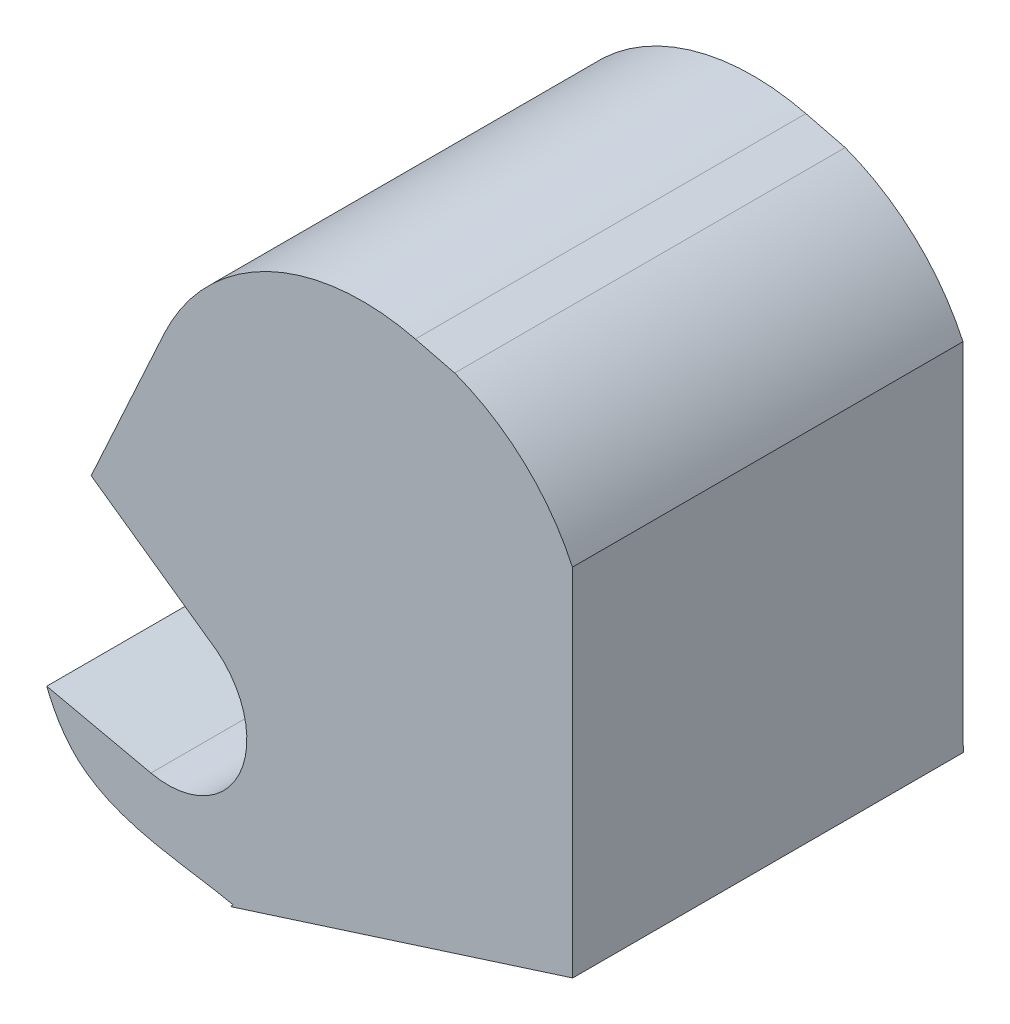
ISO-10303-21;
HEADER;
FILE_DESCRIPTION(('STEP AP214'),'2;1');
FILE_NAME('part.step','',(''),(''),'','','');
FILE_SCHEMA(('AUTOMOTIVE_DESIGN { 1 0 10303 214 1 1 1 1 }'));
ENDSEC;
DATA;
#1=APPLICATION_CONTEXT('core data for automotive mechanical design processes');
#2=APPLICATION_PROTOCOL_DEFINITION('international standard','automotive_design',2000,#1);
#3=PRODUCT_CONTEXT('',#1,'mechanical');
#4=PRODUCT('Part','Part','',(#3));
#5=PRODUCT_RELATED_PRODUCT_CATEGORY('part','',(#4));
#6=PRODUCT_DEFINITION_FORMATION('','',#4);
#7=PRODUCT_DEFINITION_CONTEXT('part definition',#1,'design');
#8=PRODUCT_DEFINITION('design','',#6,#7);
#9=PRODUCT_DEFINITION_SHAPE('','',#8);
#10=(LENGTH_UNIT() NAMED_UNIT(*) SI_UNIT(.MILLI.,.METRE.));
#11=(NAMED_UNIT(*) PLANE_ANGLE_UNIT() SI_UNIT($,.RADIAN.));
#12=(NAMED_UNIT(*) SI_UNIT($,.STERADIAN.) SOLID_ANGLE_UNIT());
#13=UNCERTAINTY_MEASURE_WITH_UNIT(LENGTH_MEASURE(1.E-05),#10,'distance_accuracy_value','');
#14=(GEOMETRIC_REPRESENTATION_CONTEXT(3) GLOBAL_UNCERTAINTY_ASSIGNED_CONTEXT((#13)) GLOBAL_UNIT_ASSIGNED_CONTEXT((#10,
#11,#12)) REPRESENTATION_CONTEXT('',''));
#15=CARTESIAN_POINT('',(0.,0.,0.));
#16=DIRECTION('',(0.,0.,1.));
#17=DIRECTION('',(1.,0.,0.));
#18=AXIS2_PLACEMENT_3D('',#15,#16,#17);
#19=CARTESIAN_POINT('',(153.531390596857,-39.6951812941398,13.));
#20=DIRECTION('',(0.576730976553272,0.816934134850484,0.));
#21=DIRECTION('',(-0.816934134850484,0.576730976553272,0.));
#22=AXIS2_PLACEMENT_3D('',#19,#20,#21);
#23=PLANE('',#22);
#24=DIRECTION('',(0.816934134850484,-0.576730976553272,0.));
#25=VECTOR('',#24,1.);
#26=CARTESIAN_POINT('',(153.531390596857,-39.6951812941398,0.));
#27=LINE('',#26,#25);
#28=CARTESIAN_POINT('',(153.531390596857,-39.6951812941398,0.));
#29=VERTEX_POINT('',#28);
#30=CARTESIAN_POINT('',(157.716593531203,-42.6498089347643,0.));
#31=VERTEX_POINT('',#30);
#32=EDGE_CURVE('E148',#29,#31,#27,.T.);
#33=ORIENTED_EDGE('',*,*,#32,.T.);
#34=DIRECTION('',(0.,0.,-1.));
#35=VECTOR('',#34,1.);
#36=CARTESIAN_POINT('',(157.716593531203,-42.6498089347643,13.));
#37=LINE('',#36,#35);
#38=CARTESIAN_POINT('',(157.716593531203,-42.6498089347643,13.));
#39=VERTEX_POINT('',#38);
#40=EDGE_CURVE('E11',#39,#31,#37,.T.);
#41=ORIENTED_EDGE('',*,*,#40,.F.);
#42=DIRECTION('',(0.816934134850484,-0.576730976553272,0.));
#43=VECTOR('',#42,1.);
#44=CARTESIAN_POINT('',(153.531390596857,-39.6951812941398,13.));
#45=LINE('',#44,#43);
#46=CARTESIAN_POINT('',(153.531390596857,-39.6951812941398,13.));
#47=VERTEX_POINT('',#46);
#48=EDGE_CURVE('E179',#47,#39,#45,.T.);
#49=ORIENTED_EDGE('',*,*,#48,.F.);
#50=DIRECTION('',(0.,0.,-1.));
#51=VECTOR('',#50,1.);
#52=CARTESIAN_POINT('',(153.531390596857,-39.6951812941398,13.));
#53=LINE('',#52,#51);
#54=EDGE_CURVE('E49',#47,#29,#53,.T.);
#55=ORIENTED_EDGE('',*,*,#54,.T.);
#56=EDGE_LOOP('',(#33,#41,#49,#55));
#57=FACE_BOUND('',#56,.T.);
#58=ADVANCED_FACE('F33',(#57),#23,.F.);
#59=CARTESIAN_POINT('',(156.089309253376,-44.7095591329998,13.));
#60=DIRECTION('',(0.,0.,-1.));
#61=DIRECTION('',(-1.,0.,0.));
#62=AXIS2_PLACEMENT_3D('',#59,#60,#61);
#63=CYLINDRICAL_SURFACE('',#62,2.62499999999874);
#64=CARTESIAN_POINT('',(156.089309253376,-44.7095591329998,0.));
#65=DIRECTION('',(0.,0.,-1.));
#66=DIRECTION('',(-1.,0.,0.));
#67=AXIS2_PLACEMENT_3D('',#64,#65,#66);
#68=CIRCLE('',#67,2.62499999999874);
#69=CARTESIAN_POINT('',(155.520515025164,-47.2721941296286,0.));
#70=VERTEX_POINT('',#69);
#71=EDGE_CURVE('E150',#31,#70,#68,.T.);
#72=ORIENTED_EDGE('',*,*,#71,.T.);
#73=DIRECTION('',(0.,0.,-1.));
#74=VECTOR('',#73,1.);
#75=CARTESIAN_POINT('',(155.520515025164,-47.2721941296286,13.));
#76=LINE('',#75,#74);
#77=CARTESIAN_POINT('',(155.520515025164,-47.2721941296286,13.));
#78=VERTEX_POINT('',#77);
#79=EDGE_CURVE('E41',#78,#70,#76,.T.);
#80=ORIENTED_EDGE('',*,*,#79,.F.);
#81=CARTESIAN_POINT('',(156.089309253376,-44.7095591329998,13.));
#82=DIRECTION('',(0.,0.,-1.));
#83=DIRECTION('',(-1.,0.,0.));
#84=AXIS2_PLACEMENT_3D('',#81,#82,#83);
#85=CIRCLE('',#84,2.62499999999874);
#86=EDGE_CURVE('E97',#39,#78,#85,.T.);
#87=ORIENTED_EDGE('',*,*,#86,.F.);
#88=ORIENTED_EDGE('',*,*,#40,.T.);
#89=EDGE_LOOP('',(#72,#80,#87,#88));
#90=FACE_BOUND('',#89,.T.);
#91=ADVANCED_FACE('F230',(#90),#63,.F.);
#92=CARTESIAN_POINT('',(155.520515025164,-47.2721941296286,13.));
#93=DIRECTION('',(-0.216683515509158,-0.976241903478125,0.));
#94=DIRECTION('',(0.976241903478125,-0.216683515509158,0.));
#95=AXIS2_PLACEMENT_3D('',#92,#93,#94);
#96=PLANE('',#95);
#97=DIRECTION('',(-0.976241903478125,0.216683515509158,0.));
#98=VECTOR('',#97,1.);
#99=CARTESIAN_POINT('',(155.520515025164,-47.2721941296286,0.));
#100=LINE('',#99,#98);
#101=CARTESIAN_POINT('',(152.052832095,-46.5025183706777,0.));
#102=VERTEX_POINT('',#101);
#103=EDGE_CURVE('E152',#70,#102,#100,.T.);
#104=ORIENTED_EDGE('',*,*,#103,.T.);
#105=DIRECTION('',(0.,0.,-1.));
#106=VECTOR('',#105,1.);
#107=CARTESIAN_POINT('',(152.052832095,-46.5025183706777,13.));
#108=LINE('',#107,#106);
#109=CARTESIAN_POINT('',(152.052832095,-46.5025183706777,13.));
#110=VERTEX_POINT('',#109);
#111=EDGE_CURVE('E192',#110,#102,#108,.T.);
#112=ORIENTED_EDGE('',*,*,#111,.F.);
#113=DIRECTION('',(-0.976241903478125,0.216683515509158,0.));
#114=VECTOR('',#113,1.);
#115=CARTESIAN_POINT('',(155.520515025164,-47.2721941296286,13.));
#116=LINE('',#115,#114);
#117=EDGE_CURVE('E199',#78,#110,#116,.T.);
#118=ORIENTED_EDGE('',*,*,#117,.F.);
#119=ORIENTED_EDGE('',*,*,#79,.T.);
#120=EDGE_LOOP('',(#104,#112,#118,#119));
#121=FACE_BOUND('',#120,.T.);
#122=ADVANCED_FACE('F197',(#121),#96,.F.);
#123=CARTESIAN_POINT('',(158.254307893064,-49.7029906048317,13.));
#124=CARTESIAN_POINT('',(156.613856564801,-49.3342334953604,13.));
#125=CARTESIAN_POINT('',(153.519768391345,-49.2918997548251,13.));
#126=CARTESIAN_POINT('',(152.261746259738,-47.0330827984404,13.));
#127=CARTESIAN_POINT('',(152.052832095,-46.5025183706777,13.));
#128=B_SPLINE_CURVE_WITH_KNOTS('',3,(#123,#124,#125,#126,#127),.UNSPECIFIED.,.F.,.F.,(4,1,4),
(0.,0.763192252642205,1.),.UNSPECIFIED.);
#129=DIRECTION('',(0.,0.,-1.));
#130=VECTOR('',#129,1.);
#131=SURFACE_OF_LINEAR_EXTRUSION('',#128,#130);
#132=CARTESIAN_POINT('',(158.254307893064,-49.7029906048317,0.));
#133=CARTESIAN_POINT('',(156.613856564801,-49.3342334953604,0.));
#134=CARTESIAN_POINT('',(153.519768391345,-49.2918997548251,0.));
#135=CARTESIAN_POINT('',(152.261746259738,-47.0330827984404,0.));
#136=CARTESIAN_POINT('',(152.052832095,-46.5025183706777,0.));
#137=B_SPLINE_CURVE_WITH_KNOTS('',3,(#132,#133,#134,#135,#136),.UNSPECIFIED.,.F.,.F.,(4,1,4),
(0.,0.763192252642205,1.),.UNSPECIFIED.);
#138=CARTESIAN_POINT('',(158.254307893064,-49.7029906048317,0.));
#139=VERTEX_POINT('',#138);
#140=EDGE_CURVE('E155',#139,#102,#137,.T.);
#141=ORIENTED_EDGE('',*,*,#140,.F.);
#142=DIRECTION('',(0.,0.,-1.));
#143=VECTOR('',#142,1.);
#144=CARTESIAN_POINT('',(158.254307893064,-49.7029906048317,13.));
#145=LINE('',#144,#143);
#146=CARTESIAN_POINT('',(158.254307893064,-49.7029906048317,13.));
#147=VERTEX_POINT('',#146);
#148=EDGE_CURVE('E190',#147,#139,#145,.T.);
#149=ORIENTED_EDGE('',*,*,#148,.F.);
#150=EDGE_CURVE('E209',#147,#110,#128,.T.);
#151=ORIENTED_EDGE('',*,*,#150,.T.);
#152=ORIENTED_EDGE('',*,*,#111,.T.);
#153=EDGE_LOOP('',(#141,#149,#151,#152));
#154=FACE_BOUND('',#153,.T.);
#155=ADVANCED_FACE('F205',(#154),#131,.T.);
#156=CARTESIAN_POINT('',(158.254307893064,-49.7029906048317,13.));
#157=DIRECTION('',(0.752580551806248,-0.658500199728902,0.));
#158=DIRECTION('',(0.658500199728902,0.752580551806248,0.));
#159=AXIS2_PLACEMENT_3D('',#156,#157,#158);
#160=PLANE('',#159);
#161=DIRECTION('',(-0.658500199728902,-0.752580551806248,0.));
#162=VECTOR('',#161,1.);
#163=CARTESIAN_POINT('',(158.254307893064,-49.7029906048317,0.));
#164=LINE('',#163,#162);
#165=CARTESIAN_POINT('',(158.172150746612,-49.7968855962634,0.));
#166=VERTEX_POINT('',#165);
#167=EDGE_CURVE('E160',#139,#166,#164,.T.);
#168=ORIENTED_EDGE('',*,*,#167,.T.);
#169=DIRECTION('',(0.,0.,-1.));
#170=VECTOR('',#169,1.);
#171=CARTESIAN_POINT('',(158.172150746612,-49.7968855962634,13.));
#172=LINE('',#171,#170);
#173=CARTESIAN_POINT('',(158.172150746612,-49.7968855962634,13.));
#174=VERTEX_POINT('',#173);
#175=EDGE_CURVE('E188',#174,#166,#172,.T.);
#176=ORIENTED_EDGE('',*,*,#175,.F.);
#177=DIRECTION('',(-0.658500199728902,-0.752580551806248,0.));
#178=VECTOR('',#177,1.);
#179=CARTESIAN_POINT('',(158.254307893064,-49.7029906048317,13.));
#180=LINE('',#179,#178);
#181=EDGE_CURVE('E210',#147,#174,#180,.T.);
#182=ORIENTED_EDGE('',*,*,#181,.F.);
#183=ORIENTED_EDGE('',*,*,#148,.T.);
#184=EDGE_LOOP('',(#168,#176,#182,#183));
#185=FACE_BOUND('',#184,.T.);
#186=ADVANCED_FACE('F227',(#185),#160,.F.);
#187=CARTESIAN_POINT('',(169.562304458751,-46.160309930931,13.));
#188=DIRECTION('',(0.304147973316343,-0.952624800394972,0.));
#189=DIRECTION('',(0.952624800394973,0.304147973316343,0.));
#190=AXIS2_PLACEMENT_3D('',#187,#188,#189);
#191=PLANE('',#190);
#192=DIRECTION('',(-0.952624800394972,-0.304147973316343,0.));
#193=VECTOR('',#192,1.);
#194=CARTESIAN_POINT('',(169.562304458751,-46.160309930931,0.));
#195=LINE('',#194,#193);
#196=CARTESIAN_POINT('',(169.562304458751,-46.160309930931,0.));
#197=VERTEX_POINT('',#196);
#198=EDGE_CURVE('E166',#197,#166,#195,.T.);
#199=ORIENTED_EDGE('',*,*,#198,.F.);
#200=DIRECTION('',(0.,0.,-1.));
#201=VECTOR('',#200,1.);
#202=CARTESIAN_POINT('',(169.562304458751,-46.160309930931,13.));
#203=LINE('',#202,#201);
#204=CARTESIAN_POINT('',(169.562304458751,-46.160309930931,13.));
#205=VERTEX_POINT('',#204);
#206=EDGE_CURVE('E186',#205,#197,#203,.T.);
#207=ORIENTED_EDGE('',*,*,#206,.F.);
#208=DIRECTION('',(-0.952624800394972,-0.304147973316343,0.));
#209=VECTOR('',#208,1.);
#210=CARTESIAN_POINT('',(169.562304458751,-46.160309930931,13.));
#211=LINE('',#210,#209);
#212=EDGE_CURVE('E212',#205,#174,#211,.T.);
#213=ORIENTED_EDGE('',*,*,#212,.T.);
#214=ORIENTED_EDGE('',*,*,#175,.T.);
#215=EDGE_LOOP('',(#199,#207,#213,#214));
#216=FACE_BOUND('',#215,.T.);
#217=ADVANCED_FACE('F255',(#216),#191,.T.);
#218=CARTESIAN_POINT('',(169.562304458751,-46.160309930931,13.));
#219=DIRECTION('',(-0.999999661893914,-0.000822321140600925,0.));
#220=DIRECTION('',(0.000822321140600925,-0.999999661893914,0.));
#221=AXIS2_PLACEMENT_3D('',#218,#219,#220);
#222=PLANE('',#221);
#223=DIRECTION('',(-0.000822321140600925,0.999999661893914,0.));
#224=VECTOR('',#223,1.);
#225=CARTESIAN_POINT('',(169.562304458751,-46.160309930931,0.));
#226=LINE('',#225,#224);
#227=CARTESIAN_POINT('',(169.552568547295,-34.3207649130281,0.));
#228=VERTEX_POINT('',#227);
#229=EDGE_CURVE('E169',#197,#228,#226,.T.);
#230=ORIENTED_EDGE('',*,*,#229,.T.);
#231=DIRECTION('',(0.,0.,-1.));
#232=VECTOR('',#231,1.);
#233=CARTESIAN_POINT('',(169.552568547295,-34.3207649130281,13.));
#234=LINE('',#233,#232);
#235=CARTESIAN_POINT('',(169.552568547295,-34.3207649130281,13.));
#236=VERTEX_POINT('',#235);
#237=EDGE_CURVE('E183',#236,#228,#234,.T.);
#238=ORIENTED_EDGE('',*,*,#237,.F.);
#239=DIRECTION('',(-0.000822321140600925,0.999999661893914,0.));
#240=VECTOR('',#239,1.);
#241=CARTESIAN_POINT('',(169.562304458751,-46.160309930931,13.));
#242=LINE('',#241,#240);
#243=EDGE_CURVE('E270',#205,#236,#242,.T.);
#244=ORIENTED_EDGE('',*,*,#243,.F.);
#245=ORIENTED_EDGE('',*,*,#206,.T.);
#246=EDGE_LOOP('',(#230,#238,#244,#245));
#247=FACE_BOUND('',#246,.T.);
#248=ADVANCED_FACE('F252',(#247),#222,.F.);
#249=CARTESIAN_POINT('',(163.163670513292,-37.2765831700951,13.));
#250=DIRECTION('',(0.,0.,-1.));
#251=DIRECTION('',(-1.,0.,0.));
#252=AXIS2_PLACEMENT_3D('',#249,#250,#251);
#253=CYLINDRICAL_SURFACE('',#252,7.03952268678084);
#254=CARTESIAN_POINT('',(163.163670513292,-37.2765831700951,0.));
#255=DIRECTION('',(0.,0.,1.));
#256=DIRECTION('',(1.,0.,0.));
#257=AXIS2_PLACEMENT_3D('',#254,#255,#256);
#258=CIRCLE('',#257,7.03952268678084);
#259=CARTESIAN_POINT('',(165.631816979212,-30.683925687678,0.));
#260=VERTEX_POINT('',#259);
#261=EDGE_CURVE('E171',#228,#260,#258,.T.);
#262=ORIENTED_EDGE('',*,*,#261,.T.);
#263=DIRECTION('',(0.,0.,-1.));
#264=VECTOR('',#263,1.);
#265=CARTESIAN_POINT('',(165.631816979212,-30.683925687678,13.));
#266=LINE('',#265,#264);
#267=CARTESIAN_POINT('',(165.631816979212,-30.683925687678,13.));
#268=VERTEX_POINT('',#267);
#269=EDGE_CURVE('E140',#268,#260,#266,.T.);
#270=ORIENTED_EDGE('',*,*,#269,.F.);
#271=CARTESIAN_POINT('',(163.163670513292,-37.2765831700951,13.));
#272=DIRECTION('',(0.,0.,1.));
#273=DIRECTION('',(1.,0.,0.));
#274=AXIS2_PLACEMENT_3D('',#271,#272,#273);
#275=CIRCLE('',#274,7.03952268678084);
#276=EDGE_CURVE('E128',#236,#268,#275,.T.);
#277=ORIENTED_EDGE('',*,*,#276,.F.);
#278=ORIENTED_EDGE('',*,*,#237,.T.);
#279=EDGE_LOOP('',(#262,#270,#277,#278));
#280=FACE_BOUND('',#279,.T.);
#281=ADVANCED_FACE('F249',(#280),#253,.T.);
#282=CARTESIAN_POINT('',(165.631816979212,-30.683925687678,13.));
#283=DIRECTION('',(-0.241123919279596,-0.970494335661598,0.));
#284=DIRECTION('',(0.970494335661598,-0.241123919279596,0.));
#285=AXIS2_PLACEMENT_3D('',#282,#283,#284);
#286=PLANE('',#285);
#287=DIRECTION('',(-0.970494335661598,0.241123919279596,0.));
#288=VECTOR('',#287,1.);
#289=CARTESIAN_POINT('',(165.631816979212,-30.683925687678,0.));
#290=LINE('',#289,#288);
#291=CARTESIAN_POINT('',(164.324728960447,-30.3591734718774,0.));
#292=VERTEX_POINT('',#291);
#293=EDGE_CURVE('E137',#260,#292,#290,.T.);
#294=ORIENTED_EDGE('',*,*,#293,.T.);
#295=DIRECTION('',(0.,0.,-1.));
#296=VECTOR('',#295,1.);
#297=CARTESIAN_POINT('',(164.324728960447,-30.3591734718774,13.));
#298=LINE('',#297,#296);
#299=CARTESIAN_POINT('',(164.324728960447,-30.3591734718774,13.));
#300=VERTEX_POINT('',#299);
#301=EDGE_CURVE('E134',#300,#292,#298,.T.);
#302=ORIENTED_EDGE('',*,*,#301,.F.);
#303=DIRECTION('',(-0.970494335661598,0.241123919279596,0.));
#304=VECTOR('',#303,1.);
#305=CARTESIAN_POINT('',(165.631816979212,-30.683925687678,13.));
#306=LINE('',#305,#304);
#307=EDGE_CURVE('E121',#268,#300,#306,.T.);
#308=ORIENTED_EDGE('',*,*,#307,.F.);
#309=ORIENTED_EDGE('',*,*,#269,.T.);
#310=EDGE_LOOP('',(#294,#302,#308,#309));
#311=FACE_BOUND('',#310,.T.);
#312=ADVANCED_FACE('F135',(#311),#286,.F.);
#313=CARTESIAN_POINT('',(162.571406159357,-37.4160836785785,13.));
#314=DIRECTION('',(0.,0.,-1.));
#315=DIRECTION('',(-1.,0.,0.));
#316=AXIS2_PLACEMENT_3D('',#313,#314,#315);
#317=CYLINDRICAL_SURFACE('',#316,7.27145944843701);
#318=CARTESIAN_POINT('',(162.571406159357,-37.4160836785785,0.));
#319=DIRECTION('',(0.,0.,1.));
#320=DIRECTION('',(1.,0.,0.));
#321=AXIS2_PLACEMENT_3D('',#318,#319,#320);
#322=CIRCLE('',#321,7.27145944843701);
#323=CARTESIAN_POINT('',(155.959571945965,-34.3899027776923,0.));
#324=VERTEX_POINT('',#323);
#325=EDGE_CURVE('E174',#292,#324,#322,.T.);
#326=ORIENTED_EDGE('',*,*,#325,.T.);
#327=DIRECTION('',(0.,0.,-1.));
#328=VECTOR('',#327,1.);
#329=CARTESIAN_POINT('',(155.959571945965,-34.3899027776923,13.));
#330=LINE('',#329,#328);
#331=CARTESIAN_POINT('',(155.959571945965,-34.3899027776923,13.));
#332=VERTEX_POINT('',#331);
#333=EDGE_CURVE('E85',#332,#324,#330,.T.);
#334=ORIENTED_EDGE('',*,*,#333,.F.);
#335=CARTESIAN_POINT('',(162.571406159357,-37.4160836785785,13.));
#336=DIRECTION('',(0.,0.,1.));
#337=DIRECTION('',(1.,0.,0.));
#338=AXIS2_PLACEMENT_3D('',#335,#336,#337);
#339=CIRCLE('',#338,7.27145944843701);
#340=EDGE_CURVE('E126',#300,#332,#339,.T.);
#341=ORIENTED_EDGE('',*,*,#340,.F.);
#342=ORIENTED_EDGE('',*,*,#301,.T.);
#343=EDGE_LOOP('',(#326,#334,#341,#342));
#344=FACE_BOUND('',#343,.T.);
#345=ADVANCED_FACE('F142',(#344),#317,.T.);
#346=CARTESIAN_POINT('',(153.531390596857,-39.6951812941398,13.));
#347=DIRECTION('',(-0.909285716337569,0.416172423479109,0.));
#348=DIRECTION('',(-0.416172423479109,-0.909285716337569,0.));
#349=AXIS2_PLACEMENT_3D('',#346,#347,#348);
#350=PLANE('',#349);
#351=DIRECTION('',(0.416172423479109,0.909285716337569,0.));
#352=VECTOR('',#351,1.);
#353=CARTESIAN_POINT('',(153.531390596857,-39.6951812941398,0.));
#354=LINE('',#353,#352);
#355=EDGE_CURVE('E176',#29,#324,#354,.T.);
#356=ORIENTED_EDGE('',*,*,#355,.F.);
#357=ORIENTED_EDGE('',*,*,#54,.F.);
#358=DIRECTION('',(0.416172423479109,0.909285716337569,0.));
#359=VECTOR('',#358,1.);
#360=CARTESIAN_POINT('',(153.531390596857,-39.6951812941398,13.));
#361=LINE('',#360,#359);
#362=EDGE_CURVE('E143',#47,#332,#361,.T.);
#363=ORIENTED_EDGE('',*,*,#362,.T.);
#364=ORIENTED_EDGE('',*,*,#333,.T.);
#365=EDGE_LOOP('',(#356,#357,#363,#364));
#366=FACE_BOUND('',#365,.T.);
#367=ADVANCED_FACE('F236',(#366),#350,.T.);
#368=CARTESIAN_POINT('',(156.089309253376,-44.7095591329998,13.));
#369=DIRECTION('',(0.,0.,-1.));
#370=DIRECTION('',(-1.,0.,0.));
#371=AXIS2_PLACEMENT_3D('',#368,#369,#370);
#372=PLANE('',#371);
#373=ORIENTED_EDGE('',*,*,#48,.T.);
#374=ORIENTED_EDGE('',*,*,#86,.T.);
#375=ORIENTED_EDGE('',*,*,#117,.T.);
#376=ORIENTED_EDGE('',*,*,#150,.F.);
#377=ORIENTED_EDGE('',*,*,#181,.T.);
#378=ORIENTED_EDGE('',*,*,#212,.F.);
#379=ORIENTED_EDGE('',*,*,#243,.T.);
#380=ORIENTED_EDGE('',*,*,#276,.T.);
#381=ORIENTED_EDGE('',*,*,#307,.T.);
#382=ORIENTED_EDGE('',*,*,#340,.T.);
#383=ORIENTED_EDGE('',*,*,#362,.F.);
#384=EDGE_LOOP('',(#373,#374,#375,#376,#377,#378,#379,#380,#381,#382,#383));
#385=FACE_BOUND('',#384,.T.);
#386=ADVANCED_FACE('F123',(#385),#372,.F.);
#387=CARTESIAN_POINT('',(156.089309253376,-44.7095591329998,0.));
#388=DIRECTION('',(0.,0.,-1.));
#389=DIRECTION('',(-1.,0.,0.));
#390=AXIS2_PLACEMENT_3D('',#387,#388,#389);
#391=PLANE('',#390);
#392=ORIENTED_EDGE('',*,*,#32,.F.);
#393=ORIENTED_EDGE('',*,*,#355,.T.);
#394=ORIENTED_EDGE('',*,*,#325,.F.);
#395=ORIENTED_EDGE('',*,*,#293,.F.);
#396=ORIENTED_EDGE('',*,*,#261,.F.);
#397=ORIENTED_EDGE('',*,*,#229,.F.);
#398=ORIENTED_EDGE('',*,*,#198,.T.);
#399=ORIENTED_EDGE('',*,*,#167,.F.);
#400=ORIENTED_EDGE('',*,*,#140,.T.);
#401=ORIENTED_EDGE('',*,*,#103,.F.);
#402=ORIENTED_EDGE('',*,*,#71,.F.);
#403=EDGE_LOOP('',(#392,#393,#394,#395,#396,#397,#398,#399,#400,#401,#402));
#404=FACE_BOUND('',#403,.T.);
#405=ADVANCED_FACE('F201',(#404),#391,.T.);
#406=CLOSED_SHELL('',(#58,#91,#122,#155,#186,#217,#248,#281,#312,#345,#367,#386,#405));
#407=MANIFOLD_SOLID_BREP('B2',#406);
#408=ADVANCED_BREP_SHAPE_REPRESENTATION('',(#18,#407),#14);
#409=SHAPE_DEFINITION_REPRESENTATION(#9,#408);
ENDSEC;
END-ISO-10303-21;
